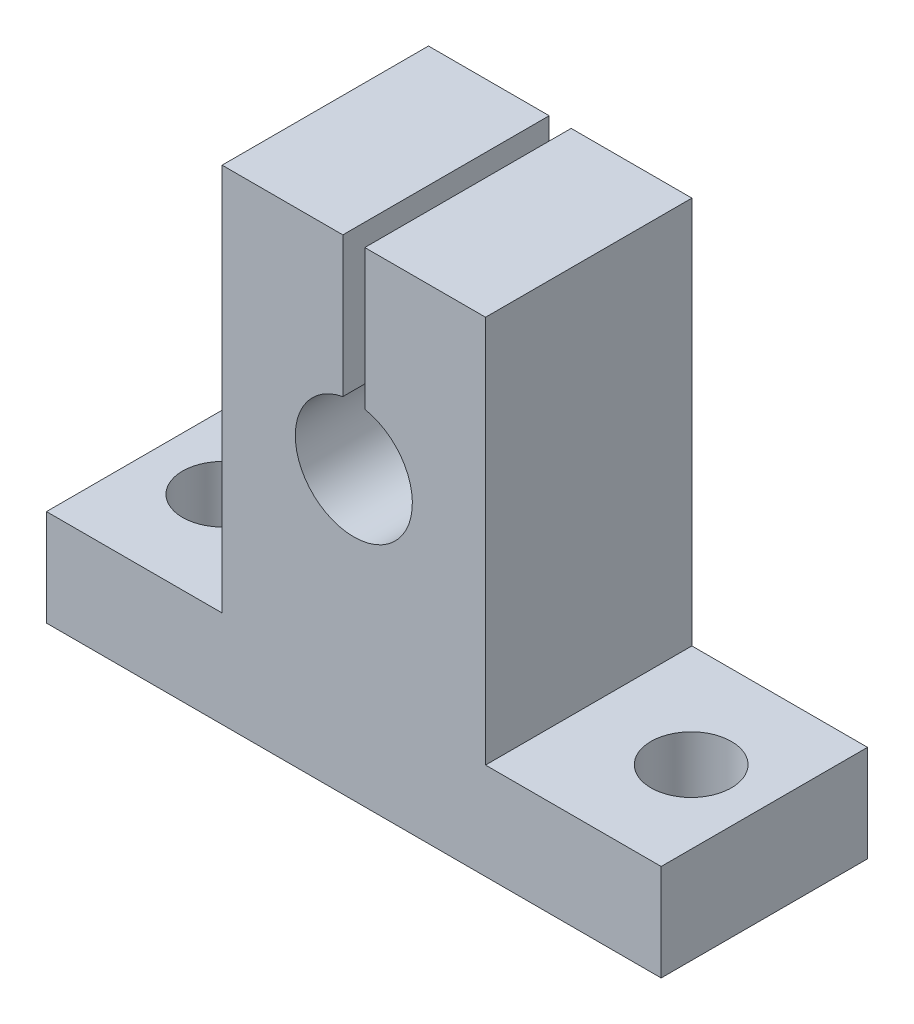
ISO-10303-21;
HEADER;
FILE_DESCRIPTION(('STEP AP214'),'2;1');
FILE_NAME('part.step','',(''),(''),'','','');
FILE_SCHEMA(('AUTOMOTIVE_DESIGN { 1 0 10303 214 1 1 1 1 }'));
ENDSEC;
DATA;
#1=APPLICATION_CONTEXT('core data for automotive mechanical design processes');
#2=APPLICATION_PROTOCOL_DEFINITION('international standard','automotive_design',2000,#1);
#3=PRODUCT_CONTEXT('',#1,'mechanical');
#4=PRODUCT('Part','Part','',(#3));
#5=PRODUCT_RELATED_PRODUCT_CATEGORY('part','',(#4));
#6=PRODUCT_DEFINITION_FORMATION('','',#4);
#7=PRODUCT_DEFINITION_CONTEXT('part definition',#1,'design');
#8=PRODUCT_DEFINITION('design','',#6,#7);
#9=PRODUCT_DEFINITION_SHAPE('','',#8);
#10=(LENGTH_UNIT() NAMED_UNIT(*) SI_UNIT(.MILLI.,.METRE.));
#11=(NAMED_UNIT(*) PLANE_ANGLE_UNIT() SI_UNIT($,.RADIAN.));
#12=(NAMED_UNIT(*) SI_UNIT($,.STERADIAN.) SOLID_ANGLE_UNIT());
#13=UNCERTAINTY_MEASURE_WITH_UNIT(LENGTH_MEASURE(1.E-05),#10,'distance_accuracy_value','');
#14=(GEOMETRIC_REPRESENTATION_CONTEXT(3) GLOBAL_UNCERTAINTY_ASSIGNED_CONTEXT((#13)) GLOBAL_UNIT_ASSIGNED_CONTEXT((#10,
#11,#12)) REPRESENTATION_CONTEXT('',''));
#15=CARTESIAN_POINT('',(0.,0.,0.));
#16=DIRECTION('',(0.,0.,1.));
#17=DIRECTION('',(1.,0.,0.));
#18=AXIS2_PLACEMENT_3D('',#15,#16,#17);
#19=CARTESIAN_POINT('',(30.,33.1,-14.1));
#20=DIRECTION('',(0.,1.,0.));
#21=DIRECTION('',(-1.,0.,0.));
#22=AXIS2_PLACEMENT_3D('',#19,#20,#21);
#23=PLANE('',#22);
#24=DIRECTION('',(0.,0.,1.));
#25=VECTOR('',#24,1.);
#26=CARTESIAN_POINT('',(21.75,33.1,-14.1));
#27=LINE('',#26,#25);
#28=CARTESIAN_POINT('',(21.75,33.1,-14.1));
#29=VERTEX_POINT('',#28);
#30=CARTESIAN_POINT('',(21.75,33.1,0.));
#31=VERTEX_POINT('',#30);
#32=EDGE_CURVE('E248',#29,#31,#27,.T.);
#33=ORIENTED_EDGE('',*,*,#32,.T.);
#34=DIRECTION('',(-1.,0.,0.));
#35=VECTOR('',#34,1.);
#36=CARTESIAN_POINT('',(30.,33.1,0.));
#37=LINE('',#36,#35);
#38=CARTESIAN_POINT('',(30.,33.1,0.));
#39=VERTEX_POINT('',#38);
#40=EDGE_CURVE('E162',#39,#31,#37,.T.);
#41=ORIENTED_EDGE('',*,*,#40,.F.);
#42=DIRECTION('',(0.,0.,1.));
#43=VECTOR('',#42,1.);
#44=CARTESIAN_POINT('',(30.,33.1,-14.1));
#45=LINE('',#44,#43);
#46=CARTESIAN_POINT('',(30.,33.1,-14.1));
#47=VERTEX_POINT('',#46);
#48=EDGE_CURVE('E135',#47,#39,#45,.T.);
#49=ORIENTED_EDGE('',*,*,#48,.F.);
#50=DIRECTION('',(-1.,0.,0.));
#51=VECTOR('',#50,1.);
#52=CARTESIAN_POINT('',(30.,33.1,-14.1));
#53=LINE('',#52,#51);
#54=EDGE_CURVE('E125',#47,#29,#53,.T.);
#55=ORIENTED_EDGE('',*,*,#54,.T.);
#56=EDGE_LOOP('',(#33,#41,#49,#55));
#57=FACE_BOUND('',#56,.T.);
#58=ADVANCED_FACE('F33',(#57),#23,.T.);
#59=CARTESIAN_POINT('',(0.,6.6,-14.1));
#60=DIRECTION('',(-1.,0.,0.));
#61=DIRECTION('',(0.,-1.,0.));
#62=AXIS2_PLACEMENT_3D('',#59,#60,#61);
#63=PLANE('',#62);
#64=DIRECTION('',(0.,-1.,0.));
#65=VECTOR('',#64,1.);
#66=CARTESIAN_POINT('',(0.,6.6,0.));
#67=LINE('',#66,#65);
#68=CARTESIAN_POINT('',(0.,6.6,0.));
#69=VERTEX_POINT('',#68);
#70=CARTESIAN_POINT('',(0.,0.,0.));
#71=VERTEX_POINT('',#70);
#72=EDGE_CURVE('E145',#69,#71,#67,.T.);
#73=ORIENTED_EDGE('',*,*,#72,.F.);
#74=DIRECTION('',(0.,0.,1.));
#75=VECTOR('',#74,1.);
#76=CARTESIAN_POINT('',(0.,6.6,-14.1));
#77=LINE('',#76,#75);
#78=CARTESIAN_POINT('',(0.,6.6,-14.1));
#79=VERTEX_POINT('',#78);
#80=EDGE_CURVE('E11',#79,#69,#77,.T.);
#81=ORIENTED_EDGE('',*,*,#80,.F.);
#82=DIRECTION('',(0.,-1.,0.));
#83=VECTOR('',#82,1.);
#84=CARTESIAN_POINT('',(0.,6.6,-14.1));
#85=LINE('',#84,#83);
#86=CARTESIAN_POINT('',(0.,0.,-14.1));
#87=VERTEX_POINT('',#86);
#88=EDGE_CURVE('E168',#79,#87,#85,.T.);
#89=ORIENTED_EDGE('',*,*,#88,.T.);
#90=DIRECTION('',(0.,0.,1.));
#91=VECTOR('',#90,1.);
#92=CARTESIAN_POINT('',(0.,0.,-14.1));
#93=LINE('',#92,#91);
#94=EDGE_CURVE('E37',#87,#71,#93,.T.);
#95=ORIENTED_EDGE('',*,*,#94,.T.);
#96=EDGE_LOOP('',(#73,#81,#89,#95));
#97=FACE_BOUND('',#96,.T.);
#98=ADVANCED_FACE('F35',(#97),#63,.T.);
#99=CARTESIAN_POINT('',(12.,6.6,-14.1));
#100=DIRECTION('',(0.,1.,0.));
#101=DIRECTION('',(0.,0.,1.));
#102=AXIS2_PLACEMENT_3D('',#99,#100,#101);
#103=PLANE('',#102);
#104=CARTESIAN_POINT('',(5.,6.6,-7.05));
#105=DIRECTION('',(0.,1.,0.));
#106=DIRECTION('',(0.,0.,1.));
#107=AXIS2_PLACEMENT_3D('',#104,#105,#106);
#108=CIRCLE('',#107,2.75);
#109=CARTESIAN_POINT('',(5.,6.6,-4.3));
#110=VERTEX_POINT('',#109);
#111=EDGE_CURVE('E236',#110,#110,#108,.T.);
#112=ORIENTED_EDGE('',*,*,#111,.F.);
#113=EDGE_LOOP('',(#112));
#114=FACE_BOUND('',#113,.T.);
#115=DIRECTION('',(-1.,0.,0.));
#116=VECTOR('',#115,1.);
#117=CARTESIAN_POINT('',(12.,6.6,0.));
#118=LINE('',#117,#116);
#119=CARTESIAN_POINT('',(12.,6.6,0.));
#120=VERTEX_POINT('',#119);
#121=EDGE_CURVE('E166',#120,#69,#118,.T.);
#122=ORIENTED_EDGE('',*,*,#121,.F.);
#123=DIRECTION('',(0.,0.,1.));
#124=VECTOR('',#123,1.);
#125=CARTESIAN_POINT('',(12.,6.6,-14.1));
#126=LINE('',#125,#124);
#127=CARTESIAN_POINT('',(12.,6.6,-14.1));
#128=VERTEX_POINT('',#127);
#129=EDGE_CURVE('E42',#128,#120,#126,.T.);
#130=ORIENTED_EDGE('',*,*,#129,.F.);
#131=DIRECTION('',(-1.,0.,0.));
#132=VECTOR('',#131,1.);
#133=CARTESIAN_POINT('',(12.,6.6,-14.1));
#134=LINE('',#133,#132);
#135=EDGE_CURVE('E139',#128,#79,#134,.T.);
#136=ORIENTED_EDGE('',*,*,#135,.T.);
#137=ORIENTED_EDGE('',*,*,#80,.T.);
#138=EDGE_LOOP('',(#122,#130,#136,#137));
#139=FACE_BOUND('',#138,.T.);
#140=ADVANCED_FACE('F181',(#114,#139),#103,.T.);
#141=CARTESIAN_POINT('',(12.,33.1,-14.1));
#142=DIRECTION('',(-1.,0.,0.));
#143=DIRECTION('',(0.,-1.,0.));
#144=AXIS2_PLACEMENT_3D('',#141,#142,#143);
#145=PLANE('',#144);
#146=DIRECTION('',(0.,-1.,0.));
#147=VECTOR('',#146,1.);
#148=CARTESIAN_POINT('',(12.,33.1,0.));
#149=LINE('',#148,#147);
#150=CARTESIAN_POINT('',(12.,33.1,0.));
#151=VERTEX_POINT('',#150);
#152=EDGE_CURVE('E134',#151,#120,#149,.T.);
#153=ORIENTED_EDGE('',*,*,#152,.F.);
#154=DIRECTION('',(0.,0.,1.));
#155=VECTOR('',#154,1.);
#156=CARTESIAN_POINT('',(12.,33.1,-14.1));
#157=LINE('',#156,#155);
#158=CARTESIAN_POINT('',(12.,33.1,-14.1));
#159=VERTEX_POINT('',#158);
#160=EDGE_CURVE('E119',#159,#151,#157,.T.);
#161=ORIENTED_EDGE('',*,*,#160,.F.);
#162=DIRECTION('',(0.,-1.,0.));
#163=VECTOR('',#162,1.);
#164=CARTESIAN_POINT('',(12.,33.1,-14.1));
#165=LINE('',#164,#163);
#166=EDGE_CURVE('E131',#159,#128,#165,.T.);
#167=ORIENTED_EDGE('',*,*,#166,.T.);
#168=ORIENTED_EDGE('',*,*,#129,.T.);
#169=EDGE_LOOP('',(#153,#161,#167,#168));
#170=FACE_BOUND('',#169,.T.);
#171=ADVANCED_FACE('F130',(#170),#145,.T.);
#172=DIRECTION('',(0.,0.,1.));
#173=VECTOR('',#172,1.);
#174=CARTESIAN_POINT('',(20.25,33.1,-14.1));
#175=LINE('',#174,#173);
#176=CARTESIAN_POINT('',(20.25,33.1,-14.1));
#177=VERTEX_POINT('',#176);
#178=CARTESIAN_POINT('',(20.25,33.1,0.));
#179=VERTEX_POINT('',#178);
#180=EDGE_CURVE('E50',#177,#179,#175,.T.);
#181=ORIENTED_EDGE('',*,*,#180,.F.);
#182=EDGE_CURVE('E115',#177,#159,#53,.T.);
#183=ORIENTED_EDGE('',*,*,#182,.T.);
#184=ORIENTED_EDGE('',*,*,#160,.T.);
#185=EDGE_CURVE('E161',#179,#151,#37,.T.);
#186=ORIENTED_EDGE('',*,*,#185,.F.);
#187=EDGE_LOOP('',(#181,#183,#184,#186));
#188=FACE_BOUND('',#187,.T.);
#189=ADVANCED_FACE('F117',(#188),#23,.T.);
#190=CARTESIAN_POINT('',(30.,6.6,-14.1));
#191=DIRECTION('',(1.,0.,0.));
#192=DIRECTION('',(0.,1.,0.));
#193=AXIS2_PLACEMENT_3D('',#190,#191,#192);
#194=PLANE('',#193);
#195=DIRECTION('',(0.,1.,0.));
#196=VECTOR('',#195,1.);
#197=CARTESIAN_POINT('',(30.,6.6,0.));
#198=LINE('',#197,#196);
#199=CARTESIAN_POINT('',(30.,6.6,0.));
#200=VERTEX_POINT('',#199);
#201=EDGE_CURVE('E158',#200,#39,#198,.T.);
#202=ORIENTED_EDGE('',*,*,#201,.F.);
#203=DIRECTION('',(0.,0.,1.));
#204=VECTOR('',#203,1.);
#205=CARTESIAN_POINT('',(30.,6.6,-14.1));
#206=LINE('',#205,#204);
#207=CARTESIAN_POINT('',(30.,6.6,-14.1));
#208=VERTEX_POINT('',#207);
#209=EDGE_CURVE('E172',#208,#200,#206,.T.);
#210=ORIENTED_EDGE('',*,*,#209,.F.);
#211=DIRECTION('',(0.,1.,0.));
#212=VECTOR('',#211,1.);
#213=CARTESIAN_POINT('',(30.,6.6,-14.1));
#214=LINE('',#213,#212);
#215=EDGE_CURVE('E126',#208,#47,#214,.T.);
#216=ORIENTED_EDGE('',*,*,#215,.T.);
#217=ORIENTED_EDGE('',*,*,#48,.T.);
#218=EDGE_LOOP('',(#202,#210,#216,#217));
#219=FACE_BOUND('',#218,.T.);
#220=ADVANCED_FACE('F200',(#219),#194,.T.);
#221=CARTESIAN_POINT('',(42.,6.6,-14.1));
#222=DIRECTION('',(0.,1.,0.));
#223=DIRECTION('',(-1.,0.,0.));
#224=AXIS2_PLACEMENT_3D('',#221,#222,#223);
#225=PLANE('',#224);
#226=CARTESIAN_POINT('',(37.,6.6,-7.05));
#227=DIRECTION('',(0.,1.,0.));
#228=DIRECTION('',(-1.,0.,0.));
#229=AXIS2_PLACEMENT_3D('',#226,#227,#228);
#230=CIRCLE('',#229,2.75);
#231=CARTESIAN_POINT('',(34.25,6.6,-7.05));
#232=VERTEX_POINT('',#231);
#233=EDGE_CURVE('E231',#232,#232,#230,.T.);
#234=ORIENTED_EDGE('',*,*,#233,.F.);
#235=EDGE_LOOP('',(#234));
#236=FACE_BOUND('',#235,.T.);
#237=DIRECTION('',(-1.,0.,0.));
#238=VECTOR('',#237,1.);
#239=CARTESIAN_POINT('',(42.,6.6,0.));
#240=LINE('',#239,#238);
#241=CARTESIAN_POINT('',(42.,6.6,0.));
#242=VERTEX_POINT('',#241);
#243=EDGE_CURVE('E155',#242,#200,#240,.T.);
#244=ORIENTED_EDGE('',*,*,#243,.F.);
#245=DIRECTION('',(0.,0.,1.));
#246=VECTOR('',#245,1.);
#247=CARTESIAN_POINT('',(42.,6.6,-14.1));
#248=LINE('',#247,#246);
#249=CARTESIAN_POINT('',(42.,6.6,-14.1));
#250=VERTEX_POINT('',#249);
#251=EDGE_CURVE('E174',#250,#242,#248,.T.);
#252=ORIENTED_EDGE('',*,*,#251,.F.);
#253=DIRECTION('',(-1.,0.,0.));
#254=VECTOR('',#253,1.);
#255=CARTESIAN_POINT('',(42.,6.6,-14.1));
#256=LINE('',#255,#254);
#257=EDGE_CURVE('E268',#250,#208,#256,.T.);
#258=ORIENTED_EDGE('',*,*,#257,.T.);
#259=ORIENTED_EDGE('',*,*,#209,.T.);
#260=EDGE_LOOP('',(#244,#252,#258,#259));
#261=FACE_BOUND('',#260,.T.);
#262=ADVANCED_FACE('F204',(#236,#261),#225,.T.);
#263=CARTESIAN_POINT('',(42.,0.,-14.1));
#264=DIRECTION('',(1.,0.,0.));
#265=DIRECTION('',(0.,0.,-1.));
#266=AXIS2_PLACEMENT_3D('',#263,#264,#265);
#267=PLANE('',#266);
#268=DIRECTION('',(0.,1.,0.));
#269=VECTOR('',#268,1.);
#270=CARTESIAN_POINT('',(42.,0.,0.));
#271=LINE('',#270,#269);
#272=CARTESIAN_POINT('',(42.,0.,0.));
#273=VERTEX_POINT('',#272);
#274=EDGE_CURVE('E152',#273,#242,#271,.T.);
#275=ORIENTED_EDGE('',*,*,#274,.F.);
#276=DIRECTION('',(0.,0.,1.));
#277=VECTOR('',#276,1.);
#278=CARTESIAN_POINT('',(42.,0.,-14.1));
#279=LINE('',#278,#277);
#280=CARTESIAN_POINT('',(42.,0.,-14.1));
#281=VERTEX_POINT('',#280);
#282=EDGE_CURVE('E175',#281,#273,#279,.T.);
#283=ORIENTED_EDGE('',*,*,#282,.F.);
#284=DIRECTION('',(0.,1.,0.));
#285=VECTOR('',#284,1.);
#286=CARTESIAN_POINT('',(42.,0.,-14.1));
#287=LINE('',#286,#285);
#288=EDGE_CURVE('E265',#281,#250,#287,.T.);
#289=ORIENTED_EDGE('',*,*,#288,.T.);
#290=ORIENTED_EDGE('',*,*,#251,.T.);
#291=EDGE_LOOP('',(#275,#283,#289,#290));
#292=FACE_BOUND('',#291,.T.);
#293=ADVANCED_FACE('F209',(#292),#267,.T.);
#294=CARTESIAN_POINT('',(0.,0.,-14.1));
#295=DIRECTION('',(0.,-1.,0.));
#296=DIRECTION('',(0.,0.,-1.));
#297=AXIS2_PLACEMENT_3D('',#294,#295,#296);
#298=PLANE('',#297);
#299=CARTESIAN_POINT('',(5.,0.,-7.05));
#300=DIRECTION('',(0.,-1.,0.));
#301=DIRECTION('',(0.,0.,-1.));
#302=AXIS2_PLACEMENT_3D('',#299,#300,#301);
#303=CIRCLE('',#302,2.75);
#304=CARTESIAN_POINT('',(5.,0.,-9.8));
#305=VERTEX_POINT('',#304);
#306=EDGE_CURVE('E225',#305,#305,#303,.T.);
#307=ORIENTED_EDGE('',*,*,#306,.F.);
#308=EDGE_LOOP('',(#307));
#309=FACE_BOUND('',#308,.T.);
#310=CARTESIAN_POINT('',(37.,0.,-7.05));
#311=DIRECTION('',(0.,-1.,0.));
#312=DIRECTION('',(0.,0.,-1.));
#313=AXIS2_PLACEMENT_3D('',#310,#311,#312);
#314=CIRCLE('',#313,2.75);
#315=CARTESIAN_POINT('',(37.,0.,-9.8));
#316=VERTEX_POINT('',#315);
#317=EDGE_CURVE('E228',#316,#316,#314,.T.);
#318=ORIENTED_EDGE('',*,*,#317,.F.);
#319=EDGE_LOOP('',(#318));
#320=FACE_BOUND('',#319,.T.);
#321=DIRECTION('',(1.,0.,0.));
#322=VECTOR('',#321,1.);
#323=CARTESIAN_POINT('',(0.,0.,0.));
#324=LINE('',#323,#322);
#325=EDGE_CURVE('E148',#71,#273,#324,.T.);
#326=ORIENTED_EDGE('',*,*,#325,.F.);
#327=ORIENTED_EDGE('',*,*,#94,.F.);
#328=DIRECTION('',(1.,0.,0.));
#329=VECTOR('',#328,1.);
#330=CARTESIAN_POINT('',(0.,0.,-14.1));
#331=LINE('',#330,#329);
#332=EDGE_CURVE('E263',#87,#281,#331,.T.);
#333=ORIENTED_EDGE('',*,*,#332,.T.);
#334=ORIENTED_EDGE('',*,*,#282,.T.);
#335=EDGE_LOOP('',(#326,#327,#333,#334));
#336=FACE_BOUND('',#335,.T.);
#337=ADVANCED_FACE('F177',(#309,#320,#336),#298,.T.);
#338=CARTESIAN_POINT('',(0.,0.,-14.1));
#339=DIRECTION('',(0.,0.,1.));
#340=DIRECTION('',(1.,0.,0.));
#341=AXIS2_PLACEMENT_3D('',#338,#339,#340);
#342=PLANE('',#341);
#343=CARTESIAN_POINT('',(21.,19.6,-14.1));
#344=DIRECTION('',(0.,0.,1.));
#345=DIRECTION('',(1.,0.,0.));
#346=AXIS2_PLACEMENT_3D('',#343,#344,#345);
#347=CIRCLE('',#346,4.);
#348=CARTESIAN_POINT('',(20.25,23.5290584113754,-14.1));
#349=VERTEX_POINT('',#348);
#350=CARTESIAN_POINT('',(21.75,23.5290584113754,-14.1));
#351=VERTEX_POINT('',#350);
#352=EDGE_CURVE('E246',#349,#351,#347,.T.);
#353=ORIENTED_EDGE('',*,*,#352,.T.);
#354=DIRECTION('',(0.,1.,0.));
#355=VECTOR('',#354,1.);
#356=CARTESIAN_POINT('',(21.75,33.1,-14.1));
#357=LINE('',#356,#355);
#358=EDGE_CURVE('E240',#351,#29,#357,.T.);
#359=ORIENTED_EDGE('',*,*,#358,.T.);
#360=ORIENTED_EDGE('',*,*,#54,.F.);
#361=ORIENTED_EDGE('',*,*,#215,.F.);
#362=ORIENTED_EDGE('',*,*,#257,.F.);
#363=ORIENTED_EDGE('',*,*,#288,.F.);
#364=ORIENTED_EDGE('',*,*,#332,.F.);
#365=ORIENTED_EDGE('',*,*,#88,.F.);
#366=ORIENTED_EDGE('',*,*,#135,.F.);
#367=ORIENTED_EDGE('',*,*,#166,.F.);
#368=ORIENTED_EDGE('',*,*,#182,.F.);
#369=DIRECTION('',(0.,-1.,0.));
#370=VECTOR('',#369,1.);
#371=CARTESIAN_POINT('',(20.25,33.1,-14.1));
#372=LINE('',#371,#370);
#373=EDGE_CURVE('E243',#177,#349,#372,.T.);
#374=ORIENTED_EDGE('',*,*,#373,.T.);
#375=EDGE_LOOP('',(#353,#359,#360,#361,#362,#363,#364,#365,#366,#367,#368,#374));
#376=FACE_BOUND('',#375,.T.);
#377=ADVANCED_FACE('F138',(#376),#342,.F.);
#378=CARTESIAN_POINT('',(0.,0.,0.));
#379=DIRECTION('',(0.,0.,1.));
#380=DIRECTION('',(1.,0.,0.));
#381=AXIS2_PLACEMENT_3D('',#378,#379,#380);
#382=PLANE('',#381);
#383=DIRECTION('',(0.,1.,0.));
#384=VECTOR('',#383,1.);
#385=CARTESIAN_POINT('',(21.75,33.1,0.));
#386=LINE('',#385,#384);
#387=CARTESIAN_POINT('',(21.75,23.5290584113754,0.));
#388=VERTEX_POINT('',#387);
#389=EDGE_CURVE('E239',#388,#31,#386,.T.);
#390=ORIENTED_EDGE('',*,*,#389,.F.);
#391=CARTESIAN_POINT('',(21.,19.6,0.));
#392=DIRECTION('',(0.,0.,1.));
#393=DIRECTION('',(1.,0.,0.));
#394=AXIS2_PLACEMENT_3D('',#391,#392,#393);
#395=CIRCLE('',#394,4.);
#396=CARTESIAN_POINT('',(20.25,23.5290584113754,0.));
#397=VERTEX_POINT('',#396);
#398=EDGE_CURVE('E244',#397,#388,#395,.T.);
#399=ORIENTED_EDGE('',*,*,#398,.F.);
#400=DIRECTION('',(0.,-1.,0.));
#401=VECTOR('',#400,1.);
#402=CARTESIAN_POINT('',(20.25,33.1,0.));
#403=LINE('',#402,#401);
#404=EDGE_CURVE('E251',#179,#397,#403,.T.);
#405=ORIENTED_EDGE('',*,*,#404,.F.);
#406=ORIENTED_EDGE('',*,*,#185,.T.);
#407=ORIENTED_EDGE('',*,*,#152,.T.);
#408=ORIENTED_EDGE('',*,*,#121,.T.);
#409=ORIENTED_EDGE('',*,*,#72,.T.);
#410=ORIENTED_EDGE('',*,*,#325,.T.);
#411=ORIENTED_EDGE('',*,*,#274,.T.);
#412=ORIENTED_EDGE('',*,*,#243,.T.);
#413=ORIENTED_EDGE('',*,*,#201,.T.);
#414=ORIENTED_EDGE('',*,*,#40,.T.);
#415=EDGE_LOOP('',(#390,#399,#405,#406,#407,#408,#409,#410,#411,#412,#413,#414));
#416=FACE_BOUND('',#415,.T.);
#417=ADVANCED_FACE('F180',(#416),#382,.T.);
#418=CARTESIAN_POINT('',(21.75,33.1,-14.1));
#419=DIRECTION('',(1.,0.,0.));
#420=DIRECTION('',(0.,0.,-1.));
#421=AXIS2_PLACEMENT_3D('',#418,#419,#420);
#422=PLANE('',#421);
#423=ORIENTED_EDGE('',*,*,#389,.T.);
#424=ORIENTED_EDGE('',*,*,#32,.F.);
#425=ORIENTED_EDGE('',*,*,#358,.F.);
#426=DIRECTION('',(0.,0.,1.));
#427=VECTOR('',#426,1.);
#428=CARTESIAN_POINT('',(21.75,23.5290584113754,-14.1));
#429=LINE('',#428,#427);
#430=EDGE_CURVE('E149',#351,#388,#429,.T.);
#431=ORIENTED_EDGE('',*,*,#430,.T.);
#432=EDGE_LOOP('',(#423,#424,#425,#431));
#433=FACE_BOUND('',#432,.T.);
#434=ADVANCED_FACE('F286',(#433),#422,.F.);
#435=CARTESIAN_POINT('',(21.,19.6,-14.1));
#436=DIRECTION('',(0.,0.,1.));
#437=DIRECTION('',(1.,0.,0.));
#438=AXIS2_PLACEMENT_3D('',#435,#436,#437);
#439=CYLINDRICAL_SURFACE('',#438,4.);
#440=ORIENTED_EDGE('',*,*,#398,.T.);
#441=ORIENTED_EDGE('',*,*,#430,.F.);
#442=ORIENTED_EDGE('',*,*,#352,.F.);
#443=DIRECTION('',(0.,0.,1.));
#444=VECTOR('',#443,1.);
#445=CARTESIAN_POINT('',(20.25,23.5290584113754,-14.1));
#446=LINE('',#445,#444);
#447=EDGE_CURVE('E257',#349,#397,#446,.T.);
#448=ORIENTED_EDGE('',*,*,#447,.T.);
#449=EDGE_LOOP('',(#440,#441,#442,#448));
#450=FACE_BOUND('',#449,.T.);
#451=ADVANCED_FACE('F293',(#450),#439,.F.);
#452=CARTESIAN_POINT('',(20.25,33.1,-14.1));
#453=DIRECTION('',(-1.,0.,0.));
#454=DIRECTION('',(0.,0.,1.));
#455=AXIS2_PLACEMENT_3D('',#452,#453,#454);
#456=PLANE('',#455);
#457=ORIENTED_EDGE('',*,*,#404,.T.);
#458=ORIENTED_EDGE('',*,*,#447,.F.);
#459=ORIENTED_EDGE('',*,*,#373,.F.);
#460=ORIENTED_EDGE('',*,*,#180,.T.);
#461=EDGE_LOOP('',(#457,#458,#459,#460));
#462=FACE_BOUND('',#461,.T.);
#463=ADVANCED_FACE('F297',(#462),#456,.F.);
#464=CARTESIAN_POINT('',(37.,33.1,-7.05));
#465=DIRECTION('',(0.,-1.,0.));
#466=DIRECTION('',(0.,0.,-1.));
#467=AXIS2_PLACEMENT_3D('',#464,#465,#466);
#468=CYLINDRICAL_SURFACE('',#467,2.75);
#469=ORIENTED_EDGE('',*,*,#233,.T.);
#470=EDGE_LOOP('',(#469));
#471=FACE_BOUND('',#470,.T.);
#472=ORIENTED_EDGE('',*,*,#317,.T.);
#473=EDGE_LOOP('',(#472));
#474=FACE_BOUND('',#473,.T.);
#475=ADVANCED_FACE('F299',(#471,#474),#468,.F.);
#476=CARTESIAN_POINT('',(5.,33.1,-7.05));
#477=DIRECTION('',(0.,-1.,0.));
#478=DIRECTION('',(0.,0.,-1.));
#479=AXIS2_PLACEMENT_3D('',#476,#477,#478);
#480=CYLINDRICAL_SURFACE('',#479,2.75);
#481=ORIENTED_EDGE('',*,*,#111,.T.);
#482=EDGE_LOOP('',(#481));
#483=FACE_BOUND('',#482,.T.);
#484=ORIENTED_EDGE('',*,*,#306,.T.);
#485=EDGE_LOOP('',(#484));
#486=FACE_BOUND('',#485,.T.);
#487=ADVANCED_FACE('F305',(#483,#486),#480,.F.);
#488=CLOSED_SHELL('',(#58,#98,#140,#171,#189,#220,#262,#293,#337,#377,#417,#434,#451,#463,#475,#487));
#489=MANIFOLD_SOLID_BREP('B2',#488);
#490=ADVANCED_BREP_SHAPE_REPRESENTATION('',(#18,#489),#14);
#491=SHAPE_DEFINITION_REPRESENTATION(#9,#490);
ENDSEC;
END-ISO-10303-21;
